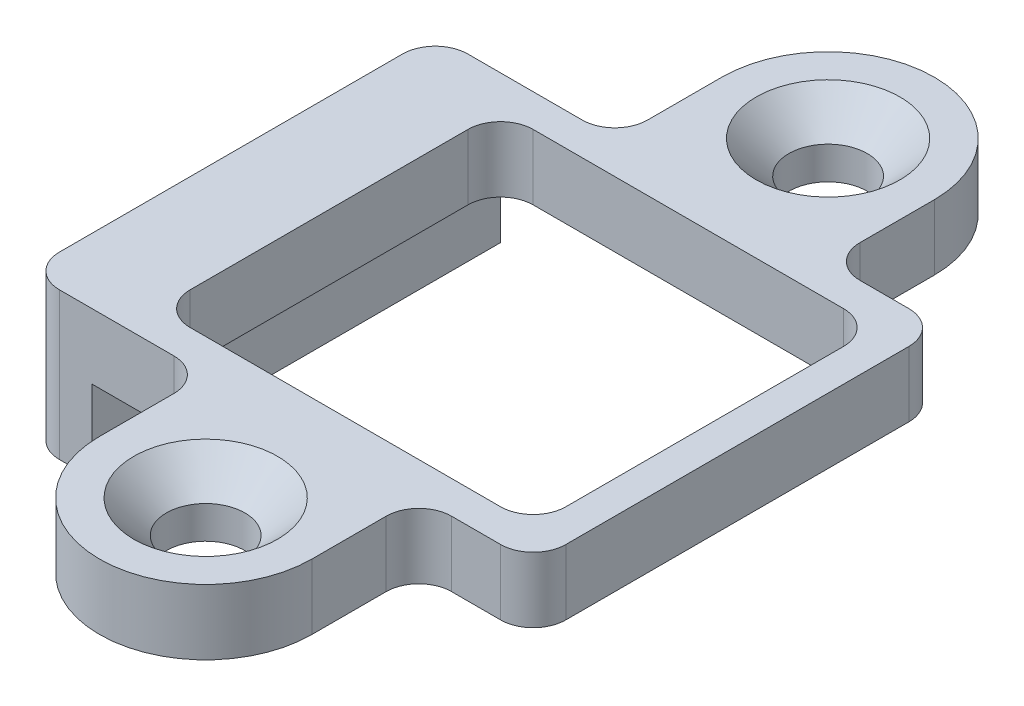
ISO-10303-21;
HEADER;
FILE_DESCRIPTION(('STEP AP214'),'2;1');
FILE_NAME('part.step','',(''),(''),'','','');
FILE_SCHEMA(('AUTOMOTIVE_DESIGN { 1 0 10303 214 1 1 1 1 }'));
ENDSEC;
DATA;
#1=APPLICATION_CONTEXT('core data for automotive mechanical design processes');
#2=APPLICATION_PROTOCOL_DEFINITION('international standard','automotive_design',2000,#1);
#3=PRODUCT_CONTEXT('',#1,'mechanical');
#4=PRODUCT('Part','Part','',(#3));
#5=PRODUCT_RELATED_PRODUCT_CATEGORY('part','',(#4));
#6=PRODUCT_DEFINITION_FORMATION('','',#4);
#7=PRODUCT_DEFINITION_CONTEXT('part definition',#1,'design');
#8=PRODUCT_DEFINITION('design','',#6,#7);
#9=PRODUCT_DEFINITION_SHAPE('','',#8);
#10=(LENGTH_UNIT() NAMED_UNIT(*) SI_UNIT(.MILLI.,.METRE.));
#11=(NAMED_UNIT(*) PLANE_ANGLE_UNIT() SI_UNIT($,.RADIAN.));
#12=(NAMED_UNIT(*) SI_UNIT($,.STERADIAN.) SOLID_ANGLE_UNIT());
#13=UNCERTAINTY_MEASURE_WITH_UNIT(LENGTH_MEASURE(1.E-05),#10,'distance_accuracy_value','');
#14=(GEOMETRIC_REPRESENTATION_CONTEXT(3) GLOBAL_UNCERTAINTY_ASSIGNED_CONTEXT((#13)) GLOBAL_UNIT_ASSIGNED_CONTEXT((#10,
#11,#12)) REPRESENTATION_CONTEXT('',''));
#15=CARTESIAN_POINT('',(0.,0.,0.));
#16=DIRECTION('',(0.,0.,1.));
#17=DIRECTION('',(1.,0.,0.));
#18=AXIS2_PLACEMENT_3D('',#15,#16,#17);
#19=CARTESIAN_POINT('',(0.,0.,0.));
#20=DIRECTION('',(0.,1.,0.));
#21=DIRECTION('',(0.,0.,1.));
#22=AXIS2_PLACEMENT_3D('',#19,#20,#21);
#23=PLANE('',#22);
#24=CARTESIAN_POINT('',(0.,0.,9.525));
#25=DIRECTION('',(0.,1.,0.));
#26=DIRECTION('',(0.,0.,1.));
#27=AXIS2_PLACEMENT_3D('',#24,#25,#26);
#28=CIRCLE('',#27,1.19999999999999);
#29=CARTESIAN_POINT('',(0.,0.,10.725));
#30=VERTEX_POINT('',#29);
#31=EDGE_CURVE('E374',#30,#30,#28,.T.);
#32=ORIENTED_EDGE('',*,*,#31,.T.);
#33=EDGE_LOOP('',(#32));
#34=FACE_BOUND('',#33,.T.);
#35=CARTESIAN_POINT('',(0.,0.,-9.525));
#36=DIRECTION('',(0.,1.,0.));
#37=DIRECTION('',(0.,0.,1.));
#38=AXIS2_PLACEMENT_3D('',#35,#36,#37);
#39=CIRCLE('',#38,1.19999999999999);
#40=CARTESIAN_POINT('',(0.,0.,-8.32500000000001));
#41=VERTEX_POINT('',#40);
#42=EDGE_CURVE('E275',#41,#41,#39,.T.);
#43=ORIENTED_EDGE('',*,*,#42,.T.);
#44=EDGE_LOOP('',(#43));
#45=FACE_BOUND('',#44,.T.);
#46=DIRECTION('',(0.,0.,1.));
#47=VECTOR('',#46,1.);
#48=CARTESIAN_POINT('',(5.75,0.,0.));
#49=LINE('',#48,#47);
#50=CARTESIAN_POINT('',(5.75,0.,-4.25000000000001));
#51=VERTEX_POINT('',#50);
#52=CARTESIAN_POINT('',(5.75,0.,4.25000000000001));
#53=VERTEX_POINT('',#52);
#54=EDGE_CURVE('E351',#51,#53,#49,.T.);
#55=ORIENTED_EDGE('',*,*,#54,.F.);
#56=CARTESIAN_POINT('',(4.75,0.,-4.25000000000001));
#57=DIRECTION('',(0.,1.,0.));
#58=DIRECTION('',(0.,0.,1.));
#59=AXIS2_PLACEMENT_3D('',#56,#57,#58);
#60=CIRCLE('',#59,1.);
#61=CARTESIAN_POINT('',(4.75,0.,-5.25000000000001));
#62=VERTEX_POINT('',#61);
#63=EDGE_CURVE('E467',#51,#62,#60,.T.);
#64=ORIENTED_EDGE('',*,*,#63,.T.);
#65=DIRECTION('',(-1.,0.,0.));
#66=VECTOR('',#65,1.);
#67=CARTESIAN_POINT('',(0.,0.,-5.25000000000001));
#68=LINE('',#67,#66);
#69=CARTESIAN_POINT('',(-4.75,0.,-5.25000000000001));
#70=VERTEX_POINT('',#69);
#71=EDGE_CURVE('E281',#62,#70,#68,.T.);
#72=ORIENTED_EDGE('',*,*,#71,.T.);
#73=CARTESIAN_POINT('',(-4.75,0.,-4.25000000000001));
#74=DIRECTION('',(0.,1.,0.));
#75=DIRECTION('',(0.,0.,1.));
#76=AXIS2_PLACEMENT_3D('',#73,#74,#75);
#77=CIRCLE('',#76,1.);
#78=CARTESIAN_POINT('',(-5.75,0.,-4.25000000000001));
#79=VERTEX_POINT('',#78);
#80=EDGE_CURVE('E471',#70,#79,#77,.T.);
#81=ORIENTED_EDGE('',*,*,#80,.T.);
#82=DIRECTION('',(0.,0.,1.));
#83=VECTOR('',#82,1.);
#84=CARTESIAN_POINT('',(-5.75,0.,0.));
#85=LINE('',#84,#83);
#86=CARTESIAN_POINT('',(-5.75,0.,4.25000000000001));
#87=VERTEX_POINT('',#86);
#88=EDGE_CURVE('E356',#79,#87,#85,.T.);
#89=ORIENTED_EDGE('',*,*,#88,.T.);
#90=CARTESIAN_POINT('',(-4.75,0.,4.25000000000001));
#91=DIRECTION('',(0.,1.,0.));
#92=DIRECTION('',(0.,0.,1.));
#93=AXIS2_PLACEMENT_3D('',#90,#91,#92);
#94=CIRCLE('',#93,1.);
#95=CARTESIAN_POINT('',(-4.75,0.,5.25000000000001));
#96=VERTEX_POINT('',#95);
#97=EDGE_CURVE('E53',#87,#96,#94,.T.);
#98=ORIENTED_EDGE('',*,*,#97,.T.);
#99=DIRECTION('',(-1.,0.,0.));
#100=VECTOR('',#99,1.);
#101=CARTESIAN_POINT('',(0.,0.,5.25000000000001));
#102=LINE('',#101,#100);
#103=CARTESIAN_POINT('',(4.75,0.,5.25000000000001));
#104=VERTEX_POINT('',#103);
#105=EDGE_CURVE('E354',#104,#96,#102,.T.);
#106=ORIENTED_EDGE('',*,*,#105,.F.);
#107=CARTESIAN_POINT('',(4.75,0.,4.25000000000001));
#108=DIRECTION('',(0.,1.,0.));
#109=DIRECTION('',(0.,0.,1.));
#110=AXIS2_PLACEMENT_3D('',#107,#108,#109);
#111=CIRCLE('',#110,1.);
#112=EDGE_CURVE('E67',#104,#53,#111,.T.);
#113=ORIENTED_EDGE('',*,*,#112,.T.);
#114=EDGE_LOOP('',(#55,#64,#72,#81,#89,#98,#106,#113));
#115=FACE_BOUND('',#114,.T.);
#116=DIRECTION('',(0.,0.,1.));
#117=VECTOR('',#116,1.);
#118=CARTESIAN_POINT('',(6.75,0.,0.));
#119=LINE('',#118,#117);
#120=CARTESIAN_POINT('',(6.75,0.,-5.25));
#121=VERTEX_POINT('',#120);
#122=CARTESIAN_POINT('',(6.75,0.,5.25));
#123=VERTEX_POINT('',#122);
#124=EDGE_CURVE('E335',#121,#123,#119,.T.);
#125=ORIENTED_EDGE('',*,*,#124,.T.);
#126=CARTESIAN_POINT('',(5.75,0.,5.25));
#127=DIRECTION('',(0.,1.,0.));
#128=DIRECTION('',(0.,0.,1.));
#129=AXIS2_PLACEMENT_3D('',#126,#127,#128);
#130=CIRCLE('',#129,1.);
#131=CARTESIAN_POINT('',(5.75,0.,6.25));
#132=VERTEX_POINT('',#131);
#133=EDGE_CURVE('E430',#123,#132,#130,.F.);
#134=ORIENTED_EDGE('',*,*,#133,.T.);
#135=DIRECTION('',(-1.,0.,0.));
#136=VECTOR('',#135,1.);
#137=CARTESIAN_POINT('',(0.,0.,6.25));
#138=LINE('',#137,#136);
#139=CARTESIAN_POINT('',(4.25,0.,6.25));
#140=VERTEX_POINT('',#139);
#141=EDGE_CURVE('E332',#132,#140,#138,.T.);
#142=ORIENTED_EDGE('',*,*,#141,.T.);
#143=CARTESIAN_POINT('',(4.25,0.,7.25));
#144=DIRECTION('',(0.,1.,0.));
#145=DIRECTION('',(0.,0.,1.));
#146=AXIS2_PLACEMENT_3D('',#143,#144,#145);
#147=CIRCLE('',#146,1.);
#148=CARTESIAN_POINT('',(3.25,0.,7.25));
#149=VERTEX_POINT('',#148);
#150=EDGE_CURVE('E459',#140,#149,#147,.T.);
#151=ORIENTED_EDGE('',*,*,#150,.T.);
#152=DIRECTION('',(0.,0.,1.));
#153=VECTOR('',#152,1.);
#154=CARTESIAN_POINT('',(3.25,0.,0.));
#155=LINE('',#154,#153);
#156=CARTESIAN_POINT('',(3.25,0.,9.525));
#157=VERTEX_POINT('',#156);
#158=EDGE_CURVE('E330',#149,#157,#155,.T.);
#159=ORIENTED_EDGE('',*,*,#158,.T.);
#160=CARTESIAN_POINT('',(0.,0.,9.525));
#161=DIRECTION('',(0.,1.,0.));
#162=DIRECTION('',(0.,0.,1.));
#163=AXIS2_PLACEMENT_3D('',#160,#161,#162);
#164=CIRCLE('',#163,3.25);
#165=CARTESIAN_POINT('',(-3.25,0.,9.525));
#166=VERTEX_POINT('',#165);
#167=EDGE_CURVE('E327',#166,#157,#164,.T.);
#168=ORIENTED_EDGE('',*,*,#167,.F.);
#169=DIRECTION('',(0.,0.,1.));
#170=VECTOR('',#169,1.);
#171=CARTESIAN_POINT('',(-3.25,0.,0.));
#172=LINE('',#171,#170);
#173=CARTESIAN_POINT('',(-3.25,0.,7.25));
#174=VERTEX_POINT('',#173);
#175=EDGE_CURVE('E325',#174,#166,#172,.T.);
#176=ORIENTED_EDGE('',*,*,#175,.F.);
#177=CARTESIAN_POINT('',(-4.25,0.,7.25));
#178=DIRECTION('',(0.,1.,0.));
#179=DIRECTION('',(0.,0.,1.));
#180=AXIS2_PLACEMENT_3D('',#177,#178,#179);
#181=CIRCLE('',#180,1.);
#182=CARTESIAN_POINT('',(-4.25,0.,6.25));
#183=VERTEX_POINT('',#182);
#184=EDGE_CURVE('E463',#174,#183,#181,.T.);
#185=ORIENTED_EDGE('',*,*,#184,.T.);
#186=DIRECTION('',(-1.,0.,0.));
#187=VECTOR('',#186,1.);
#188=CARTESIAN_POINT('',(0.,0.,6.25));
#189=LINE('',#188,#187);
#190=CARTESIAN_POINT('',(-6.75,0.,6.25));
#191=VERTEX_POINT('',#190);
#192=EDGE_CURVE('E276',#183,#191,#189,.T.);
#193=ORIENTED_EDGE('',*,*,#192,.T.);
#194=DIRECTION('',(0.,0.,1.));
#195=VECTOR('',#194,1.);
#196=CARTESIAN_POINT('',(-6.75,0.,0.));
#197=LINE('',#196,#195);
#198=CARTESIAN_POINT('',(-6.75,0.,-6.25));
#199=VERTEX_POINT('',#198);
#200=EDGE_CURVE('E258',#199,#191,#197,.T.);
#201=ORIENTED_EDGE('',*,*,#200,.F.);
#202=DIRECTION('',(-1.,0.,0.));
#203=VECTOR('',#202,1.);
#204=CARTESIAN_POINT('',(0.,0.,-6.25));
#205=LINE('',#204,#203);
#206=CARTESIAN_POINT('',(-4.25,0.,-6.25));
#207=VERTEX_POINT('',#206);
#208=EDGE_CURVE('E349',#207,#199,#205,.T.);
#209=ORIENTED_EDGE('',*,*,#208,.F.);
#210=CARTESIAN_POINT('',(-4.25,0.,-7.25));
#211=DIRECTION('',(0.,1.,0.));
#212=DIRECTION('',(0.,0.,1.));
#213=AXIS2_PLACEMENT_3D('',#210,#211,#212);
#214=CIRCLE('',#213,1.);
#215=CARTESIAN_POINT('',(-3.25,0.,-7.25));
#216=VERTEX_POINT('',#215);
#217=EDGE_CURVE('E451',#207,#216,#214,.T.);
#218=ORIENTED_EDGE('',*,*,#217,.T.);
#219=DIRECTION('',(0.,0.,1.));
#220=VECTOR('',#219,1.);
#221=CARTESIAN_POINT('',(-3.25,0.,0.));
#222=LINE('',#221,#220);
#223=CARTESIAN_POINT('',(-3.25,0.,-9.525));
#224=VERTEX_POINT('',#223);
#225=EDGE_CURVE('E346',#224,#216,#222,.T.);
#226=ORIENTED_EDGE('',*,*,#225,.F.);
#227=CARTESIAN_POINT('',(0.,0.,-9.525));
#228=DIRECTION('',(0.,1.,0.));
#229=DIRECTION('',(0.,0.,1.));
#230=AXIS2_PLACEMENT_3D('',#227,#228,#229);
#231=CIRCLE('',#230,3.25);
#232=CARTESIAN_POINT('',(3.24999999999999,0.,-9.525));
#233=VERTEX_POINT('',#232);
#234=EDGE_CURVE('E344',#233,#224,#231,.T.);
#235=ORIENTED_EDGE('',*,*,#234,.F.);
#236=DIRECTION('',(0.,0.,1.));
#237=VECTOR('',#236,1.);
#238=CARTESIAN_POINT('',(3.25,0.,0.));
#239=LINE('',#238,#237);
#240=CARTESIAN_POINT('',(3.25,0.,-7.25));
#241=VERTEX_POINT('',#240);
#242=EDGE_CURVE('E341',#233,#241,#239,.T.);
#243=ORIENTED_EDGE('',*,*,#242,.T.);
#244=CARTESIAN_POINT('',(4.24999999999999,0.,-7.25));
#245=DIRECTION('',(0.,1.,0.));
#246=DIRECTION('',(0.,0.,1.));
#247=AXIS2_PLACEMENT_3D('',#244,#245,#246);
#248=CIRCLE('',#247,1.);
#249=CARTESIAN_POINT('',(4.24999999999999,0.,-6.25));
#250=VERTEX_POINT('',#249);
#251=EDGE_CURVE('E455',#241,#250,#248,.T.);
#252=ORIENTED_EDGE('',*,*,#251,.T.);
#253=DIRECTION('',(-1.,0.,0.));
#254=VECTOR('',#253,1.);
#255=CARTESIAN_POINT('',(0.,0.,-6.25));
#256=LINE('',#255,#254);
#257=CARTESIAN_POINT('',(5.75,0.,-6.25));
#258=VERTEX_POINT('',#257);
#259=EDGE_CURVE('E338',#258,#250,#256,.T.);
#260=ORIENTED_EDGE('',*,*,#259,.F.);
#261=CARTESIAN_POINT('',(5.75,0.,-5.25));
#262=DIRECTION('',(0.,1.,0.));
#263=DIRECTION('',(0.,0.,1.));
#264=AXIS2_PLACEMENT_3D('',#261,#262,#263);
#265=CIRCLE('',#264,1.);
#266=EDGE_CURVE('E428',#258,#121,#265,.F.);
#267=ORIENTED_EDGE('',*,*,#266,.T.);
#268=EDGE_LOOP('',(#125,#134,#142,#151,#159,#168,#176,#185,#193,#201,#209,#218,#226,#235,#243,
#252,#260,#267));
#269=FACE_BOUND('',#268,.T.);
#270=ADVANCED_FACE('F45',(#34,#45,#115,#269),#23,.F.);
#271=CARTESIAN_POINT('',(5.75,2.,0.));
#272=DIRECTION('',(1.,0.,0.));
#273=DIRECTION('',(0.,0.,-1.));
#274=AXIS2_PLACEMENT_3D('',#271,#272,#273);
#275=PLANE('',#274);
#276=DIRECTION('',(0.,0.,1.));
#277=VECTOR('',#276,1.);
#278=CARTESIAN_POINT('',(5.75,2.,0.));
#279=LINE('',#278,#277);
#280=CARTESIAN_POINT('',(5.75,2.,-4.25000000000001));
#281=VERTEX_POINT('',#280);
#282=CARTESIAN_POINT('',(5.75,2.,4.25000000000001));
#283=VERTEX_POINT('',#282);
#284=EDGE_CURVE('E311',#281,#283,#279,.T.);
#285=ORIENTED_EDGE('',*,*,#284,.F.);
#286=DIRECTION('',(0.,-1.,0.));
#287=VECTOR('',#286,1.);
#288=CARTESIAN_POINT('',(5.75,2.,-4.25000000000001));
#289=LINE('',#288,#287);
#290=EDGE_CURVE('E434',#281,#51,#289,.T.);
#291=ORIENTED_EDGE('',*,*,#290,.T.);
#292=ORIENTED_EDGE('',*,*,#54,.T.);
#293=DIRECTION('',(0.,-1.,0.));
#294=VECTOR('',#293,1.);
#295=CARTESIAN_POINT('',(5.75,2.,4.25000000000001));
#296=LINE('',#295,#294);
#297=EDGE_CURVE('E432',#53,#283,#296,.F.);
#298=ORIENTED_EDGE('',*,*,#297,.T.);
#299=EDGE_LOOP('',(#285,#291,#292,#298));
#300=FACE_BOUND('',#299,.T.);
#301=ADVANCED_FACE('F499',(#300),#275,.F.);
#302=CARTESIAN_POINT('',(0.,2.,5.25000000000001));
#303=DIRECTION('',(0.,0.,1.));
#304=DIRECTION('',(1.,0.,0.));
#305=AXIS2_PLACEMENT_3D('',#302,#303,#304);
#306=PLANE('',#305);
#307=DIRECTION('',(-1.,0.,0.));
#308=VECTOR('',#307,1.);
#309=CARTESIAN_POINT('',(0.,2.,5.25000000000001));
#310=LINE('',#309,#308);
#311=CARTESIAN_POINT('',(4.75,2.,5.25000000000001));
#312=VERTEX_POINT('',#311);
#313=CARTESIAN_POINT('',(-4.75,2.,5.25000000000001));
#314=VERTEX_POINT('',#313);
#315=EDGE_CURVE('E314',#312,#314,#310,.T.);
#316=ORIENTED_EDGE('',*,*,#315,.F.);
#317=DIRECTION('',(0.,-1.,0.));
#318=VECTOR('',#317,1.);
#319=CARTESIAN_POINT('',(4.75,0.,5.25000000000001));
#320=LINE('',#319,#318);
#321=EDGE_CURVE('E449',#312,#104,#320,.T.);
#322=ORIENTED_EDGE('',*,*,#321,.T.);
#323=ORIENTED_EDGE('',*,*,#105,.T.);
#324=DIRECTION('',(0.,-1.,0.));
#325=VECTOR('',#324,1.);
#326=CARTESIAN_POINT('',(-4.75,2.,5.25000000000001));
#327=LINE('',#326,#325);
#328=EDGE_CURVE('E447',#96,#314,#327,.F.);
#329=ORIENTED_EDGE('',*,*,#328,.T.);
#330=EDGE_LOOP('',(#316,#322,#323,#329));
#331=FACE_BOUND('',#330,.T.);
#332=ADVANCED_FACE('F485',(#331),#306,.F.);
#333=CARTESIAN_POINT('',(-5.75,2.,0.));
#334=DIRECTION('',(1.,0.,0.));
#335=DIRECTION('',(0.,0.,-1.));
#336=AXIS2_PLACEMENT_3D('',#333,#334,#335);
#337=PLANE('',#336);
#338=ORIENTED_EDGE('',*,*,#88,.F.);
#339=DIRECTION('',(0.,-1.,0.));
#340=VECTOR('',#339,1.);
#341=CARTESIAN_POINT('',(-5.75,2.,-4.25000000000001));
#342=LINE('',#341,#340);
#343=CARTESIAN_POINT('',(-5.75,2.,-4.25000000000001));
#344=VERTEX_POINT('',#343);
#345=EDGE_CURVE('E445',#79,#344,#342,.F.);
#346=ORIENTED_EDGE('',*,*,#345,.T.);
#347=DIRECTION('',(0.,0.,1.));
#348=VECTOR('',#347,1.);
#349=CARTESIAN_POINT('',(-5.75,2.,0.));
#350=LINE('',#349,#348);
#351=CARTESIAN_POINT('',(-5.75,2.,4.25000000000001));
#352=VERTEX_POINT('',#351);
#353=EDGE_CURVE('E317',#344,#352,#350,.T.);
#354=ORIENTED_EDGE('',*,*,#353,.T.);
#355=DIRECTION('',(0.,-1.,0.));
#356=VECTOR('',#355,1.);
#357=CARTESIAN_POINT('',(-5.75,2.,4.25000000000001));
#358=LINE('',#357,#356);
#359=EDGE_CURVE('E442',#352,#87,#358,.T.);
#360=ORIENTED_EDGE('',*,*,#359,.T.);
#361=EDGE_LOOP('',(#338,#346,#354,#360));
#362=FACE_BOUND('',#361,.T.);
#363=ADVANCED_FACE('F516',(#362),#337,.T.);
#364=CARTESIAN_POINT('',(0.,2.,6.25));
#365=DIRECTION('',(0.,0.,1.));
#366=DIRECTION('',(1.,0.,0.));
#367=AXIS2_PLACEMENT_3D('',#364,#365,#366);
#368=PLANE('',#367);
#369=DIRECTION('',(-1.,0.,0.));
#370=VECTOR('',#369,1.);
#371=CARTESIAN_POINT('',(0.,2.,6.25));
#372=LINE('',#371,#370);
#373=CARTESIAN_POINT('',(-4.25,2.,6.25));
#374=VERTEX_POINT('',#373);
#375=CARTESIAN_POINT('',(-7.75,2.,6.25));
#376=VERTEX_POINT('',#375);
#377=EDGE_CURVE('E278',#374,#376,#372,.T.);
#378=ORIENTED_EDGE('',*,*,#377,.T.);
#379=DIRECTION('',(0.,-1.,0.));
#380=VECTOR('',#379,1.);
#381=CARTESIAN_POINT('',(-7.75,-2.5,6.25));
#382=LINE('',#381,#380);
#383=CARTESIAN_POINT('',(-7.75,-2.5,6.25));
#384=VERTEX_POINT('',#383);
#385=EDGE_CURVE('E267',#376,#384,#382,.T.);
#386=ORIENTED_EDGE('',*,*,#385,.T.);
#387=DIRECTION('',(-1.,0.,0.));
#388=VECTOR('',#387,1.);
#389=CARTESIAN_POINT('',(0.,-2.5,6.25));
#390=LINE('',#389,#388);
#391=CARTESIAN_POINT('',(-6.75,-2.5,6.25));
#392=VERTEX_POINT('',#391);
#393=EDGE_CURVE('E247',#392,#384,#390,.T.);
#394=ORIENTED_EDGE('',*,*,#393,.F.);
#395=DIRECTION('',(0.,1.,0.));
#396=VECTOR('',#395,1.);
#397=CARTESIAN_POINT('',(-6.75,-2.5,6.25));
#398=LINE('',#397,#396);
#399=EDGE_CURVE('E252',#392,#191,#398,.T.);
#400=ORIENTED_EDGE('',*,*,#399,.T.);
#401=ORIENTED_EDGE('',*,*,#192,.F.);
#402=DIRECTION('',(0.,-1.,0.));
#403=VECTOR('',#402,1.);
#404=CARTESIAN_POINT('',(-4.25,2.,6.25));
#405=LINE('',#404,#403);
#406=EDGE_CURVE('E370',#183,#374,#405,.F.);
#407=ORIENTED_EDGE('',*,*,#406,.T.);
#408=EDGE_LOOP('',(#378,#386,#394,#400,#401,#407));
#409=FACE_BOUND('',#408,.T.);
#410=ADVANCED_FACE('F265',(#409),#368,.T.);
#411=CARTESIAN_POINT('',(-3.25,2.,0.));
#412=DIRECTION('',(1.,0.,0.));
#413=DIRECTION('',(0.,0.,-1.));
#414=AXIS2_PLACEMENT_3D('',#411,#412,#413);
#415=PLANE('',#414);
#416=DIRECTION('',(0.,0.,1.));
#417=VECTOR('',#416,1.);
#418=CARTESIAN_POINT('',(-3.25,2.,0.));
#419=LINE('',#418,#417);
#420=CARTESIAN_POINT('',(-3.25,2.,7.25));
#421=VERTEX_POINT('',#420);
#422=CARTESIAN_POINT('',(-3.25,2.,9.525));
#423=VERTEX_POINT('',#422);
#424=EDGE_CURVE('E280',#421,#423,#419,.T.);
#425=ORIENTED_EDGE('',*,*,#424,.F.);
#426=DIRECTION('',(0.,-1.,0.));
#427=VECTOR('',#426,1.);
#428=CARTESIAN_POINT('',(-3.25,2.,7.25));
#429=LINE('',#428,#427);
#430=EDGE_CURVE('E420',#421,#174,#429,.T.);
#431=ORIENTED_EDGE('',*,*,#430,.T.);
#432=ORIENTED_EDGE('',*,*,#175,.T.);
#433=DIRECTION('',(0.,-1.,0.));
#434=VECTOR('',#433,1.);
#435=CARTESIAN_POINT('',(-3.25,2.,9.525));
#436=LINE('',#435,#434);
#437=EDGE_CURVE('E367',#423,#166,#436,.T.);
#438=ORIENTED_EDGE('',*,*,#437,.F.);
#439=EDGE_LOOP('',(#425,#431,#432,#438));
#440=FACE_BOUND('',#439,.T.);
#441=ADVANCED_FACE('F560',(#440),#415,.F.);
#442=CARTESIAN_POINT('',(0.,2.,9.525));
#443=DIRECTION('',(0.,-1.,0.));
#444=DIRECTION('',(0.,0.,-1.));
#445=AXIS2_PLACEMENT_3D('',#442,#443,#444);
#446=CYLINDRICAL_SURFACE('',#445,3.25);
#447=ORIENTED_EDGE('',*,*,#167,.T.);
#448=DIRECTION('',(0.,-1.,0.));
#449=VECTOR('',#448,1.);
#450=CARTESIAN_POINT('',(3.25,2.,9.525));
#451=LINE('',#450,#449);
#452=CARTESIAN_POINT('',(3.25,2.,9.525));
#453=VERTEX_POINT('',#452);
#454=EDGE_CURVE('E364',#453,#157,#451,.T.);
#455=ORIENTED_EDGE('',*,*,#454,.F.);
#456=CARTESIAN_POINT('',(0.,2.,9.525));
#457=DIRECTION('',(0.,1.,0.));
#458=DIRECTION('',(0.,0.,1.));
#459=AXIS2_PLACEMENT_3D('',#456,#457,#458);
#460=CIRCLE('',#459,3.25);
#461=EDGE_CURVE('E283',#423,#453,#460,.T.);
#462=ORIENTED_EDGE('',*,*,#461,.F.);
#463=ORIENTED_EDGE('',*,*,#437,.T.);
#464=EDGE_LOOP('',(#447,#455,#462,#463));
#465=FACE_BOUND('',#464,.T.);
#466=ADVANCED_FACE('F556',(#465),#446,.T.);
#467=CARTESIAN_POINT('',(3.25,2.,0.));
#468=DIRECTION('',(1.,0.,0.));
#469=DIRECTION('',(0.,0.,-1.));
#470=AXIS2_PLACEMENT_3D('',#467,#468,#469);
#471=PLANE('',#470);
#472=ORIENTED_EDGE('',*,*,#158,.F.);
#473=DIRECTION('',(0.,-1.,0.));
#474=VECTOR('',#473,1.);
#475=CARTESIAN_POINT('',(3.25,2.,7.25));
#476=LINE('',#475,#474);
#477=CARTESIAN_POINT('',(3.25,2.,7.25));
#478=VERTEX_POINT('',#477);
#479=EDGE_CURVE('E418',#149,#478,#476,.F.);
#480=ORIENTED_EDGE('',*,*,#479,.T.);
#481=DIRECTION('',(0.,0.,1.));
#482=VECTOR('',#481,1.);
#483=CARTESIAN_POINT('',(3.25,2.,0.));
#484=LINE('',#483,#482);
#485=EDGE_CURVE('E286',#478,#453,#484,.T.);
#486=ORIENTED_EDGE('',*,*,#485,.T.);
#487=ORIENTED_EDGE('',*,*,#454,.T.);
#488=EDGE_LOOP('',(#472,#480,#486,#487));
#489=FACE_BOUND('',#488,.T.);
#490=ADVANCED_FACE('F552',(#489),#471,.T.);
#491=CARTESIAN_POINT('',(0.,2.,6.25));
#492=DIRECTION('',(0.,0.,1.));
#493=DIRECTION('',(1.,0.,0.));
#494=AXIS2_PLACEMENT_3D('',#491,#492,#493);
#495=PLANE('',#494);
#496=DIRECTION('',(-1.,0.,0.));
#497=VECTOR('',#496,1.);
#498=CARTESIAN_POINT('',(0.,2.,6.25));
#499=LINE('',#498,#497);
#500=CARTESIAN_POINT('',(5.75,2.,6.25));
#501=VERTEX_POINT('',#500);
#502=CARTESIAN_POINT('',(4.25,2.,6.25));
#503=VERTEX_POINT('',#502);
#504=EDGE_CURVE('E288',#501,#503,#499,.T.);
#505=ORIENTED_EDGE('',*,*,#504,.T.);
#506=DIRECTION('',(0.,-1.,0.));
#507=VECTOR('',#506,1.);
#508=CARTESIAN_POINT('',(4.25,0.,6.25));
#509=LINE('',#508,#507);
#510=EDGE_CURVE('E415',#503,#140,#509,.T.);
#511=ORIENTED_EDGE('',*,*,#510,.T.);
#512=ORIENTED_EDGE('',*,*,#141,.F.);
#513=DIRECTION('',(0.,-1.,0.));
#514=VECTOR('',#513,1.);
#515=CARTESIAN_POINT('',(5.75,2.,6.25));
#516=LINE('',#515,#514);
#517=EDGE_CURVE('E413',#132,#501,#516,.F.);
#518=ORIENTED_EDGE('',*,*,#517,.T.);
#519=EDGE_LOOP('',(#505,#511,#512,#518));
#520=FACE_BOUND('',#519,.T.);
#521=ADVANCED_FACE('F548',(#520),#495,.T.);
#522=CARTESIAN_POINT('',(6.75,2.,0.));
#523=DIRECTION('',(1.,0.,0.));
#524=DIRECTION('',(0.,0.,-1.));
#525=AXIS2_PLACEMENT_3D('',#522,#523,#524);
#526=PLANE('',#525);
#527=DIRECTION('',(0.,0.,1.));
#528=VECTOR('',#527,1.);
#529=CARTESIAN_POINT('',(6.75,2.,0.));
#530=LINE('',#529,#528);
#531=CARTESIAN_POINT('',(6.75,2.,-5.25));
#532=VERTEX_POINT('',#531);
#533=CARTESIAN_POINT('',(6.75,2.,5.25));
#534=VERTEX_POINT('',#533);
#535=EDGE_CURVE('E291',#532,#534,#530,.T.);
#536=ORIENTED_EDGE('',*,*,#535,.T.);
#537=DIRECTION('',(0.,-1.,0.));
#538=VECTOR('',#537,1.);
#539=CARTESIAN_POINT('',(6.75,2.,5.25));
#540=LINE('',#539,#538);
#541=EDGE_CURVE('E425',#534,#123,#540,.T.);
#542=ORIENTED_EDGE('',*,*,#541,.T.);
#543=ORIENTED_EDGE('',*,*,#124,.F.);
#544=DIRECTION('',(0.,-1.,0.));
#545=VECTOR('',#544,1.);
#546=CARTESIAN_POINT('',(6.75,2.,-5.25));
#547=LINE('',#546,#545);
#548=EDGE_CURVE('E423',#121,#532,#547,.F.);
#549=ORIENTED_EDGE('',*,*,#548,.T.);
#550=EDGE_LOOP('',(#536,#542,#543,#549));
#551=FACE_BOUND('',#550,.T.);
#552=ADVANCED_FACE('F544',(#551),#526,.T.);
#553=CARTESIAN_POINT('',(0.,2.,-6.25));
#554=DIRECTION('',(0.,0.,1.));
#555=DIRECTION('',(1.,0.,0.));
#556=AXIS2_PLACEMENT_3D('',#553,#554,#555);
#557=PLANE('',#556);
#558=ORIENTED_EDGE('',*,*,#259,.T.);
#559=DIRECTION('',(0.,-1.,0.));
#560=VECTOR('',#559,1.);
#561=CARTESIAN_POINT('',(4.24999999999999,2.,-6.25));
#562=LINE('',#561,#560);
#563=CARTESIAN_POINT('',(4.24999999999999,2.,-6.25));
#564=VERTEX_POINT('',#563);
#565=EDGE_CURVE('E411',#250,#564,#562,.F.);
#566=ORIENTED_EDGE('',*,*,#565,.T.);
#567=DIRECTION('',(-1.,0.,0.));
#568=VECTOR('',#567,1.);
#569=CARTESIAN_POINT('',(0.,2.,-6.25));
#570=LINE('',#569,#568);
#571=CARTESIAN_POINT('',(5.75,2.,-6.25));
#572=VERTEX_POINT('',#571);
#573=EDGE_CURVE('E294',#572,#564,#570,.T.);
#574=ORIENTED_EDGE('',*,*,#573,.F.);
#575=DIRECTION('',(0.,-1.,0.));
#576=VECTOR('',#575,1.);
#577=CARTESIAN_POINT('',(5.75,0.,-6.25));
#578=LINE('',#577,#576);
#579=EDGE_CURVE('E408',#572,#258,#578,.T.);
#580=ORIENTED_EDGE('',*,*,#579,.T.);
#581=EDGE_LOOP('',(#558,#566,#574,#580));
#582=FACE_BOUND('',#581,.T.);
#583=ADVANCED_FACE('F540',(#582),#557,.F.);
#584=CARTESIAN_POINT('',(3.25,2.,0.));
#585=DIRECTION('',(1.,0.,0.));
#586=DIRECTION('',(0.,0.,-1.));
#587=AXIS2_PLACEMENT_3D('',#584,#585,#586);
#588=PLANE('',#587);
#589=DIRECTION('',(0.,0.,1.));
#590=VECTOR('',#589,1.);
#591=CARTESIAN_POINT('',(3.25,2.,0.));
#592=LINE('',#591,#590);
#593=CARTESIAN_POINT('',(3.24999999999999,2.,-9.525));
#594=VERTEX_POINT('',#593);
#595=CARTESIAN_POINT('',(3.25,2.,-7.25));
#596=VERTEX_POINT('',#595);
#597=EDGE_CURVE('E297',#594,#596,#592,.T.);
#598=ORIENTED_EDGE('',*,*,#597,.T.);
#599=DIRECTION('',(0.,-1.,0.));
#600=VECTOR('',#599,1.);
#601=CARTESIAN_POINT('',(3.25,2.,-7.25));
#602=LINE('',#601,#600);
#603=EDGE_CURVE('E405',#596,#241,#602,.T.);
#604=ORIENTED_EDGE('',*,*,#603,.T.);
#605=ORIENTED_EDGE('',*,*,#242,.F.);
#606=DIRECTION('',(0.,-1.,0.));
#607=VECTOR('',#606,1.);
#608=CARTESIAN_POINT('',(3.24999999999999,2.,-9.525));
#609=LINE('',#608,#607);
#610=EDGE_CURVE('E362',#594,#233,#609,.T.);
#611=ORIENTED_EDGE('',*,*,#610,.F.);
#612=EDGE_LOOP('',(#598,#604,#605,#611));
#613=FACE_BOUND('',#612,.T.);
#614=ADVANCED_FACE('F536',(#613),#588,.T.);
#615=CARTESIAN_POINT('',(0.,2.,-9.525));
#616=DIRECTION('',(0.,-1.,0.));
#617=DIRECTION('',(0.,0.,-1.));
#618=AXIS2_PLACEMENT_3D('',#615,#616,#617);
#619=CYLINDRICAL_SURFACE('',#618,3.25);
#620=ORIENTED_EDGE('',*,*,#234,.T.);
#621=DIRECTION('',(0.,-1.,0.));
#622=VECTOR('',#621,1.);
#623=CARTESIAN_POINT('',(-3.25,2.,-9.525));
#624=LINE('',#623,#622);
#625=CARTESIAN_POINT('',(-3.25,2.,-9.525));
#626=VERTEX_POINT('',#625);
#627=EDGE_CURVE('E323',#626,#224,#624,.T.);
#628=ORIENTED_EDGE('',*,*,#627,.F.);
#629=CARTESIAN_POINT('',(0.,2.,-9.525));
#630=DIRECTION('',(0.,1.,0.));
#631=DIRECTION('',(0.,0.,1.));
#632=AXIS2_PLACEMENT_3D('',#629,#630,#631);
#633=CIRCLE('',#632,3.25);
#634=EDGE_CURVE('E300',#594,#626,#633,.T.);
#635=ORIENTED_EDGE('',*,*,#634,.F.);
#636=ORIENTED_EDGE('',*,*,#610,.T.);
#637=EDGE_LOOP('',(#620,#628,#635,#636));
#638=FACE_BOUND('',#637,.T.);
#639=ADVANCED_FACE('F532',(#638),#619,.T.);
#640=CARTESIAN_POINT('',(-3.25,2.,0.));
#641=DIRECTION('',(1.,0.,0.));
#642=DIRECTION('',(0.,0.,-1.));
#643=AXIS2_PLACEMENT_3D('',#640,#641,#642);
#644=PLANE('',#643);
#645=ORIENTED_EDGE('',*,*,#225,.T.);
#646=DIRECTION('',(0.,-1.,0.));
#647=VECTOR('',#646,1.);
#648=CARTESIAN_POINT('',(-3.25,2.,-7.25));
#649=LINE('',#648,#647);
#650=CARTESIAN_POINT('',(-3.25,2.,-7.25));
#651=VERTEX_POINT('',#650);
#652=EDGE_CURVE('E403',#216,#651,#649,.F.);
#653=ORIENTED_EDGE('',*,*,#652,.T.);
#654=DIRECTION('',(0.,0.,1.));
#655=VECTOR('',#654,1.);
#656=CARTESIAN_POINT('',(-3.25,2.,0.));
#657=LINE('',#656,#655);
#658=EDGE_CURVE('E302',#626,#651,#657,.T.);
#659=ORIENTED_EDGE('',*,*,#658,.F.);
#660=ORIENTED_EDGE('',*,*,#627,.T.);
#661=EDGE_LOOP('',(#645,#653,#659,#660));
#662=FACE_BOUND('',#661,.T.);
#663=ADVANCED_FACE('F528',(#662),#644,.F.);
#664=CARTESIAN_POINT('',(0.,2.,-6.25));
#665=DIRECTION('',(0.,0.,1.));
#666=DIRECTION('',(1.,0.,0.));
#667=AXIS2_PLACEMENT_3D('',#664,#665,#666);
#668=PLANE('',#667);
#669=DIRECTION('',(-1.,0.,0.));
#670=VECTOR('',#669,1.);
#671=CARTESIAN_POINT('',(0.,-2.5,-6.25));
#672=LINE('',#671,#670);
#673=CARTESIAN_POINT('',(-6.75,-2.5,-6.25));
#674=VERTEX_POINT('',#673);
#675=CARTESIAN_POINT('',(-7.75,-2.5,-6.25));
#676=VERTEX_POINT('',#675);
#677=EDGE_CURVE('E249',#674,#676,#672,.T.);
#678=ORIENTED_EDGE('',*,*,#677,.T.);
#679=DIRECTION('',(0.,-1.,0.));
#680=VECTOR('',#679,1.);
#681=CARTESIAN_POINT('',(-7.75,2.,-6.25));
#682=LINE('',#681,#680);
#683=CARTESIAN_POINT('',(-7.75,2.,-6.25));
#684=VERTEX_POINT('',#683);
#685=EDGE_CURVE('E401',#676,#684,#682,.F.);
#686=ORIENTED_EDGE('',*,*,#685,.T.);
#687=DIRECTION('',(-1.,0.,0.));
#688=VECTOR('',#687,1.);
#689=CARTESIAN_POINT('',(0.,2.,-6.25));
#690=LINE('',#689,#688);
#691=CARTESIAN_POINT('',(-4.25,2.,-6.25));
#692=VERTEX_POINT('',#691);
#693=EDGE_CURVE('E305',#692,#684,#690,.T.);
#694=ORIENTED_EDGE('',*,*,#693,.F.);
#695=DIRECTION('',(0.,-1.,0.));
#696=VECTOR('',#695,1.);
#697=CARTESIAN_POINT('',(-4.25,0.,-6.25));
#698=LINE('',#697,#696);
#699=EDGE_CURVE('E398',#692,#207,#698,.T.);
#700=ORIENTED_EDGE('',*,*,#699,.T.);
#701=ORIENTED_EDGE('',*,*,#208,.T.);
#702=DIRECTION('',(0.,1.,0.));
#703=VECTOR('',#702,1.);
#704=CARTESIAN_POINT('',(-6.75,-2.5,-6.25));
#705=LINE('',#704,#703);
#706=EDGE_CURVE('E261',#674,#199,#705,.T.);
#707=ORIENTED_EDGE('',*,*,#706,.F.);
#708=EDGE_LOOP('',(#678,#686,#694,#700,#701,#707));
#709=FACE_BOUND('',#708,.T.);
#710=ADVANCED_FACE('F524',(#709),#668,.F.);
#711=CARTESIAN_POINT('',(-8.75,2.,0.));
#712=DIRECTION('',(1.,0.,0.));
#713=DIRECTION('',(0.,0.,-1.));
#714=AXIS2_PLACEMENT_3D('',#711,#712,#713);
#715=PLANE('',#714);
#716=DIRECTION('',(0.,0.,1.));
#717=VECTOR('',#716,1.);
#718=CARTESIAN_POINT('',(-8.75,-2.5,0.));
#719=LINE('',#718,#717);
#720=CARTESIAN_POINT('',(-8.75,-2.5,-5.25));
#721=VERTEX_POINT('',#720);
#722=CARTESIAN_POINT('',(-8.75,-2.5,5.25));
#723=VERTEX_POINT('',#722);
#724=EDGE_CURVE('E268',#721,#723,#719,.T.);
#725=ORIENTED_EDGE('',*,*,#724,.T.);
#726=DIRECTION('',(0.,-1.,0.));
#727=VECTOR('',#726,1.);
#728=CARTESIAN_POINT('',(-8.75,2.,5.25));
#729=LINE('',#728,#727);
#730=CARTESIAN_POINT('',(-8.75,2.,5.25));
#731=VERTEX_POINT('',#730);
#732=EDGE_CURVE('E388',#723,#731,#729,.F.);
#733=ORIENTED_EDGE('',*,*,#732,.T.);
#734=DIRECTION('',(0.,0.,1.));
#735=VECTOR('',#734,1.);
#736=CARTESIAN_POINT('',(-8.75,2.,0.));
#737=LINE('',#736,#735);
#738=CARTESIAN_POINT('',(-8.75,2.,-5.25));
#739=VERTEX_POINT('',#738);
#740=EDGE_CURVE('E308',#739,#731,#737,.T.);
#741=ORIENTED_EDGE('',*,*,#740,.F.);
#742=DIRECTION('',(0.,-1.,0.));
#743=VECTOR('',#742,1.);
#744=CARTESIAN_POINT('',(-8.75,2.,-5.25));
#745=LINE('',#744,#743);
#746=EDGE_CURVE('E385',#739,#721,#745,.T.);
#747=ORIENTED_EDGE('',*,*,#746,.T.);
#748=EDGE_LOOP('',(#725,#733,#741,#747));
#749=FACE_BOUND('',#748,.T.);
#750=ADVANCED_FACE('F514',(#749),#715,.F.);
#751=CARTESIAN_POINT('',(0.,2.,-5.25000000000001));
#752=DIRECTION('',(0.,0.,1.));
#753=DIRECTION('',(1.,0.,0.));
#754=AXIS2_PLACEMENT_3D('',#751,#752,#753);
#755=PLANE('',#754);
#756=ORIENTED_EDGE('',*,*,#71,.F.);
#757=DIRECTION('',(0.,-1.,0.));
#758=VECTOR('',#757,1.);
#759=CARTESIAN_POINT('',(4.75,2.,-5.25000000000001));
#760=LINE('',#759,#758);
#761=CARTESIAN_POINT('',(4.75,2.,-5.25000000000001));
#762=VERTEX_POINT('',#761);
#763=EDGE_CURVE('E440',#62,#762,#760,.F.);
#764=ORIENTED_EDGE('',*,*,#763,.T.);
#765=DIRECTION('',(-1.,0.,0.));
#766=VECTOR('',#765,1.);
#767=CARTESIAN_POINT('',(0.,2.,-5.25000000000001));
#768=LINE('',#767,#766);
#769=CARTESIAN_POINT('',(-4.75,2.,-5.25000000000001));
#770=VERTEX_POINT('',#769);
#771=EDGE_CURVE('E320',#762,#770,#768,.T.);
#772=ORIENTED_EDGE('',*,*,#771,.T.);
#773=DIRECTION('',(0.,-1.,0.));
#774=VECTOR('',#773,1.);
#775=CARTESIAN_POINT('',(-4.75,0.,-5.25000000000001));
#776=LINE('',#775,#774);
#777=EDGE_CURVE('E437',#770,#70,#776,.T.);
#778=ORIENTED_EDGE('',*,*,#777,.T.);
#779=EDGE_LOOP('',(#756,#764,#772,#778));
#780=FACE_BOUND('',#779,.T.);
#781=ADVANCED_FACE('F511',(#780),#755,.T.);
#782=CARTESIAN_POINT('',(0.,2.,0.));
#783=DIRECTION('',(0.,1.,0.));
#784=DIRECTION('',(0.,0.,1.));
#785=AXIS2_PLACEMENT_3D('',#782,#783,#784);
#786=PLANE('',#785);
#787=CARTESIAN_POINT('',(0.,2.,9.525));
#788=DIRECTION('',(0.,1.,0.));
#789=DIRECTION('',(0.,0.,1.));
#790=AXIS2_PLACEMENT_3D('',#787,#788,#789);
#791=CIRCLE('',#790,2.2);
#792=CARTESIAN_POINT('',(0.,2.,11.725));
#793=VERTEX_POINT('',#792);
#794=EDGE_CURVE('E673',#793,#793,#791,.T.);
#795=ORIENTED_EDGE('',*,*,#794,.F.);
#796=EDGE_LOOP('',(#795));
#797=FACE_BOUND('',#796,.T.);
#798=CARTESIAN_POINT('',(0.,2.,-9.525));
#799=DIRECTION('',(0.,1.,0.));
#800=DIRECTION('',(0.,0.,1.));
#801=AXIS2_PLACEMENT_3D('',#798,#799,#800);
#802=CIRCLE('',#801,2.2);
#803=CARTESIAN_POINT('',(0.,2.,-7.325));
#804=VERTEX_POINT('',#803);
#805=EDGE_CURVE('E377',#804,#804,#802,.T.);
#806=ORIENTED_EDGE('',*,*,#805,.F.);
#807=EDGE_LOOP('',(#806));
#808=FACE_BOUND('',#807,.T.);
#809=ORIENTED_EDGE('',*,*,#740,.T.);
#810=CARTESIAN_POINT('',(-7.75,2.,5.25));
#811=DIRECTION('',(0.,1.,0.));
#812=DIRECTION('',(0.,0.,1.));
#813=AXIS2_PLACEMENT_3D('',#810,#811,#812);
#814=CIRCLE('',#813,1.);
#815=EDGE_CURVE('E396',#731,#376,#814,.T.);
#816=ORIENTED_EDGE('',*,*,#815,.T.);
#817=ORIENTED_EDGE('',*,*,#377,.F.);
#818=CARTESIAN_POINT('',(-4.25,2.,7.25));
#819=DIRECTION('',(0.,1.,0.));
#820=DIRECTION('',(0.,0.,1.));
#821=AXIS2_PLACEMENT_3D('',#818,#819,#820);
#822=CIRCLE('',#821,1.);
#823=EDGE_CURVE('E465',#374,#421,#822,.F.);
#824=ORIENTED_EDGE('',*,*,#823,.T.);
#825=ORIENTED_EDGE('',*,*,#424,.T.);
#826=ORIENTED_EDGE('',*,*,#461,.T.);
#827=ORIENTED_EDGE('',*,*,#485,.F.);
#828=CARTESIAN_POINT('',(4.25,2.,7.25));
#829=DIRECTION('',(0.,1.,0.));
#830=DIRECTION('',(0.,0.,1.));
#831=AXIS2_PLACEMENT_3D('',#828,#829,#830);
#832=CIRCLE('',#831,1.);
#833=EDGE_CURVE('E461',#478,#503,#832,.F.);
#834=ORIENTED_EDGE('',*,*,#833,.T.);
#835=ORIENTED_EDGE('',*,*,#504,.F.);
#836=CARTESIAN_POINT('',(5.75,2.,5.25));
#837=DIRECTION('',(0.,1.,0.));
#838=DIRECTION('',(0.,0.,1.));
#839=AXIS2_PLACEMENT_3D('',#836,#837,#838);
#840=CIRCLE('',#839,1.);
#841=EDGE_CURVE('E392',#501,#534,#840,.T.);
#842=ORIENTED_EDGE('',*,*,#841,.T.);
#843=ORIENTED_EDGE('',*,*,#535,.F.);
#844=CARTESIAN_POINT('',(5.75,2.,-5.25));
#845=DIRECTION('',(0.,1.,0.));
#846=DIRECTION('',(0.,0.,1.));
#847=AXIS2_PLACEMENT_3D('',#844,#845,#846);
#848=CIRCLE('',#847,1.);
#849=EDGE_CURVE('E390',#532,#572,#848,.T.);
#850=ORIENTED_EDGE('',*,*,#849,.T.);
#851=ORIENTED_EDGE('',*,*,#573,.T.);
#852=CARTESIAN_POINT('',(4.24999999999999,2.,-7.25));
#853=DIRECTION('',(0.,1.,0.));
#854=DIRECTION('',(0.,0.,1.));
#855=AXIS2_PLACEMENT_3D('',#852,#853,#854);
#856=CIRCLE('',#855,1.);
#857=EDGE_CURVE('E457',#564,#596,#856,.F.);
#858=ORIENTED_EDGE('',*,*,#857,.T.);
#859=ORIENTED_EDGE('',*,*,#597,.F.);
#860=ORIENTED_EDGE('',*,*,#634,.T.);
#861=ORIENTED_EDGE('',*,*,#658,.T.);
#862=CARTESIAN_POINT('',(-4.25,2.,-7.25));
#863=DIRECTION('',(0.,1.,0.));
#864=DIRECTION('',(0.,0.,1.));
#865=AXIS2_PLACEMENT_3D('',#862,#863,#864);
#866=CIRCLE('',#865,1.);
#867=EDGE_CURVE('E453',#651,#692,#866,.F.);
#868=ORIENTED_EDGE('',*,*,#867,.T.);
#869=ORIENTED_EDGE('',*,*,#693,.T.);
#870=CARTESIAN_POINT('',(-7.75,2.,-5.25));
#871=DIRECTION('',(0.,1.,0.));
#872=DIRECTION('',(0.,0.,1.));
#873=AXIS2_PLACEMENT_3D('',#870,#871,#872);
#874=CIRCLE('',#873,1.);
#875=EDGE_CURVE('E394',#684,#739,#874,.T.);
#876=ORIENTED_EDGE('',*,*,#875,.T.);
#877=EDGE_LOOP('',(#809,#816,#817,#824,#825,#826,#827,#834,#835,#842,#843,#850,#851,#858,#859,
#860,#861,#868,#869,#876));
#878=FACE_BOUND('',#877,.T.);
#879=ORIENTED_EDGE('',*,*,#771,.F.);
#880=CARTESIAN_POINT('',(4.75,2.,-4.25000000000001));
#881=DIRECTION('',(0.,1.,0.));
#882=DIRECTION('',(0.,0.,1.));
#883=AXIS2_PLACEMENT_3D('',#880,#881,#882);
#884=CIRCLE('',#883,1.);
#885=EDGE_CURVE('E469',#762,#281,#884,.F.);
#886=ORIENTED_EDGE('',*,*,#885,.T.);
#887=ORIENTED_EDGE('',*,*,#284,.T.);
#888=CARTESIAN_POINT('',(4.75,2.,4.25000000000001));
#889=DIRECTION('',(0.,1.,0.));
#890=DIRECTION('',(0.,0.,1.));
#891=AXIS2_PLACEMENT_3D('',#888,#889,#890);
#892=CIRCLE('',#891,1.);
#893=EDGE_CURVE('E476',#283,#312,#892,.F.);
#894=ORIENTED_EDGE('',*,*,#893,.T.);
#895=ORIENTED_EDGE('',*,*,#315,.T.);
#896=CARTESIAN_POINT('',(-4.75,2.,4.25000000000001));
#897=DIRECTION('',(0.,1.,0.));
#898=DIRECTION('',(0.,0.,1.));
#899=AXIS2_PLACEMENT_3D('',#896,#897,#898);
#900=CIRCLE('',#899,1.);
#901=EDGE_CURVE('E13',#314,#352,#900,.F.);
#902=ORIENTED_EDGE('',*,*,#901,.T.);
#903=ORIENTED_EDGE('',*,*,#353,.F.);
#904=CARTESIAN_POINT('',(-4.75,2.,-4.25000000000001));
#905=DIRECTION('',(0.,1.,0.));
#906=DIRECTION('',(0.,0.,1.));
#907=AXIS2_PLACEMENT_3D('',#904,#905,#906);
#908=CIRCLE('',#907,1.);
#909=EDGE_CURVE('E473',#344,#770,#908,.F.);
#910=ORIENTED_EDGE('',*,*,#909,.T.);
#911=EDGE_LOOP('',(#879,#886,#887,#894,#895,#902,#903,#910));
#912=FACE_BOUND('',#911,.T.);
#913=ADVANCED_FACE('F481',(#797,#808,#878,#912),#786,.T.);
#914=CARTESIAN_POINT('',(-6.75,-2.5,0.));
#915=DIRECTION('',(-1.,0.,0.));
#916=DIRECTION('',(0.,0.,1.));
#917=AXIS2_PLACEMENT_3D('',#914,#915,#916);
#918=PLANE('',#917);
#919=ORIENTED_EDGE('',*,*,#200,.T.);
#920=ORIENTED_EDGE('',*,*,#399,.F.);
#921=DIRECTION('',(0.,0.,1.));
#922=VECTOR('',#921,1.);
#923=CARTESIAN_POINT('',(-6.75,-2.5,0.));
#924=LINE('',#923,#922);
#925=EDGE_CURVE('E243',#674,#392,#924,.T.);
#926=ORIENTED_EDGE('',*,*,#925,.F.);
#927=ORIENTED_EDGE('',*,*,#706,.T.);
#928=EDGE_LOOP('',(#919,#920,#926,#927));
#929=FACE_BOUND('',#928,.T.);
#930=ADVANCED_FACE('F256',(#929),#918,.F.);
#931=CARTESIAN_POINT('',(0.,-2.5,0.));
#932=DIRECTION('',(0.,1.,0.));
#933=DIRECTION('',(0.,0.,1.));
#934=AXIS2_PLACEMENT_3D('',#931,#932,#933);
#935=PLANE('',#934);
#936=ORIENTED_EDGE('',*,*,#393,.T.);
#937=CARTESIAN_POINT('',(-7.75,-2.5,5.25));
#938=DIRECTION('',(0.,1.,0.));
#939=DIRECTION('',(0.,0.,1.));
#940=AXIS2_PLACEMENT_3D('',#937,#938,#939);
#941=CIRCLE('',#940,1.);
#942=EDGE_CURVE('E383',#384,#723,#941,.F.);
#943=ORIENTED_EDGE('',*,*,#942,.T.);
#944=ORIENTED_EDGE('',*,*,#724,.F.);
#945=CARTESIAN_POINT('',(-7.75,-2.5,-5.25));
#946=DIRECTION('',(0.,1.,0.));
#947=DIRECTION('',(0.,0.,1.));
#948=AXIS2_PLACEMENT_3D('',#945,#946,#947);
#949=CIRCLE('',#948,1.);
#950=EDGE_CURVE('E381',#721,#676,#949,.F.);
#951=ORIENTED_EDGE('',*,*,#950,.T.);
#952=ORIENTED_EDGE('',*,*,#677,.F.);
#953=ORIENTED_EDGE('',*,*,#925,.T.);
#954=EDGE_LOOP('',(#936,#943,#944,#951,#952,#953));
#955=FACE_BOUND('',#954,.T.);
#956=ADVANCED_FACE('F245',(#955),#935,.F.);
#957=CARTESIAN_POINT('',(0.,2.,-9.525));
#958=DIRECTION('',(0.,1.,0.));
#959=DIRECTION('',(0.,0.,1.));
#960=AXIS2_PLACEMENT_3D('',#957,#958,#959);
#961=CYLINDRICAL_SURFACE('',#960,1.19999999999999);
#962=CARTESIAN_POINT('',(0.,0.999999999999999,-9.525));
#963=DIRECTION('',(0.,1.,0.));
#964=DIRECTION('',(0.,0.,1.));
#965=AXIS2_PLACEMENT_3D('',#962,#963,#964);
#966=CIRCLE('',#965,1.19999999999999);
#967=CARTESIAN_POINT('',(0.,0.999999999999999,-8.32500000000001));
#968=VERTEX_POINT('',#967);
#969=EDGE_CURVE('E373',#968,#968,#966,.T.);
#970=ORIENTED_EDGE('',*,*,#969,.T.);
#971=EDGE_LOOP('',(#970));
#972=FACE_BOUND('',#971,.T.);
#973=ORIENTED_EDGE('',*,*,#42,.F.);
#974=EDGE_LOOP('',(#973));
#975=FACE_BOUND('',#974,.T.);
#976=ADVANCED_FACE('F685',(#972,#975),#961,.F.);
#977=CARTESIAN_POINT('',(0.,2.,-9.525));
#978=DIRECTION('',(0.,1.,0.));
#979=DIRECTION('',(0.,0.,1.));
#980=AXIS2_PLACEMENT_3D('',#977,#978,#979);
#981=CONICAL_SURFACE('',#980,2.2,0.785398163397453);
#982=ORIENTED_EDGE('',*,*,#969,.F.);
#983=EDGE_LOOP('',(#982));
#984=FACE_BOUND('',#983,.T.);
#985=ORIENTED_EDGE('',*,*,#805,.T.);
#986=EDGE_LOOP('',(#985));
#987=FACE_BOUND('',#986,.T.);
#988=ADVANCED_FACE('F682',(#984,#987),#981,.F.);
#989=CARTESIAN_POINT('',(0.,2.,9.525));
#990=DIRECTION('',(0.,1.,0.));
#991=DIRECTION('',(0.,0.,1.));
#992=AXIS2_PLACEMENT_3D('',#989,#990,#991);
#993=CYLINDRICAL_SURFACE('',#992,1.19999999999999);
#994=CARTESIAN_POINT('',(0.,0.999999999999999,9.525));
#995=DIRECTION('',(0.,1.,0.));
#996=DIRECTION('',(0.,0.,1.));
#997=AXIS2_PLACEMENT_3D('',#994,#995,#996);
#998=CIRCLE('',#997,1.19999999999999);
#999=CARTESIAN_POINT('',(0.,0.999999999999999,10.725));
#1000=VERTEX_POINT('',#999);
#1001=EDGE_CURVE('E378',#1000,#1000,#998,.T.);
#1002=ORIENTED_EDGE('',*,*,#1001,.T.);
#1003=EDGE_LOOP('',(#1002));
#1004=FACE_BOUND('',#1003,.T.);
#1005=ORIENTED_EDGE('',*,*,#31,.F.);
#1006=EDGE_LOOP('',(#1005));
#1007=FACE_BOUND('',#1006,.T.);
#1008=ADVANCED_FACE('F684',(#1004,#1007),#993,.F.);
#1009=CARTESIAN_POINT('',(0.,2.,9.525));
#1010=DIRECTION('',(0.,1.,0.));
#1011=DIRECTION('',(0.,0.,1.));
#1012=AXIS2_PLACEMENT_3D('',#1009,#1010,#1011);
#1013=CONICAL_SURFACE('',#1012,2.2,0.785398163397453);
#1014=ORIENTED_EDGE('',*,*,#1001,.F.);
#1015=EDGE_LOOP('',(#1014));
#1016=FACE_BOUND('',#1015,.T.);
#1017=ORIENTED_EDGE('',*,*,#794,.T.);
#1018=EDGE_LOOP('',(#1017));
#1019=FACE_BOUND('',#1018,.T.);
#1020=ADVANCED_FACE('F571',(#1016,#1019),#1013,.F.);
#1021=CARTESIAN_POINT('',(-7.75,2.,5.25));
#1022=DIRECTION('',(0.,1.,0.));
#1023=DIRECTION('',(0.,0.,1.));
#1024=AXIS2_PLACEMENT_3D('',#1021,#1022,#1023);
#1025=CYLINDRICAL_SURFACE('',#1024,1.);
#1026=ORIENTED_EDGE('',*,*,#815,.F.);
#1027=ORIENTED_EDGE('',*,*,#732,.F.);
#1028=ORIENTED_EDGE('',*,*,#942,.F.);
#1029=ORIENTED_EDGE('',*,*,#385,.F.);
#1030=EDGE_LOOP('',(#1026,#1027,#1028,#1029));
#1031=FACE_BOUND('',#1030,.T.);
#1032=ADVANCED_FACE('F567',(#1031),#1025,.T.);
#1033=CARTESIAN_POINT('',(-7.75,2.,-5.25));
#1034=DIRECTION('',(0.,-1.,0.));
#1035=DIRECTION('',(0.,0.,-1.));
#1036=AXIS2_PLACEMENT_3D('',#1033,#1034,#1035);
#1037=CYLINDRICAL_SURFACE('',#1036,1.);
#1038=ORIENTED_EDGE('',*,*,#875,.F.);
#1039=ORIENTED_EDGE('',*,*,#685,.F.);
#1040=ORIENTED_EDGE('',*,*,#950,.F.);
#1041=ORIENTED_EDGE('',*,*,#746,.F.);
#1042=EDGE_LOOP('',(#1038,#1039,#1040,#1041));
#1043=FACE_BOUND('',#1042,.T.);
#1044=ADVANCED_FACE('F570',(#1043),#1037,.T.);
#1045=CARTESIAN_POINT('',(-4.25,2.,-7.25));
#1046=DIRECTION('',(0.,1.,0.));
#1047=DIRECTION('',(0.,0.,1.));
#1048=AXIS2_PLACEMENT_3D('',#1045,#1046,#1047);
#1049=CYLINDRICAL_SURFACE('',#1048,1.);
#1050=ORIENTED_EDGE('',*,*,#867,.F.);
#1051=ORIENTED_EDGE('',*,*,#652,.F.);
#1052=ORIENTED_EDGE('',*,*,#217,.F.);
#1053=ORIENTED_EDGE('',*,*,#699,.F.);
#1054=EDGE_LOOP('',(#1050,#1051,#1052,#1053));
#1055=FACE_BOUND('',#1054,.T.);
#1056=ADVANCED_FACE('F575',(#1055),#1049,.F.);
#1057=CARTESIAN_POINT('',(4.24999999999999,2.,-7.25));
#1058=DIRECTION('',(0.,-1.,0.));
#1059=DIRECTION('',(0.,0.,-1.));
#1060=AXIS2_PLACEMENT_3D('',#1057,#1058,#1059);
#1061=CYLINDRICAL_SURFACE('',#1060,1.);
#1062=ORIENTED_EDGE('',*,*,#857,.F.);
#1063=ORIENTED_EDGE('',*,*,#565,.F.);
#1064=ORIENTED_EDGE('',*,*,#251,.F.);
#1065=ORIENTED_EDGE('',*,*,#603,.F.);
#1066=EDGE_LOOP('',(#1062,#1063,#1064,#1065));
#1067=FACE_BOUND('',#1066,.T.);
#1068=ADVANCED_FACE('F579',(#1067),#1061,.F.);
#1069=CARTESIAN_POINT('',(4.25,2.,7.25));
#1070=DIRECTION('',(0.,1.,0.));
#1071=DIRECTION('',(0.,0.,1.));
#1072=AXIS2_PLACEMENT_3D('',#1069,#1070,#1071);
#1073=CYLINDRICAL_SURFACE('',#1072,1.);
#1074=ORIENTED_EDGE('',*,*,#833,.F.);
#1075=ORIENTED_EDGE('',*,*,#479,.F.);
#1076=ORIENTED_EDGE('',*,*,#150,.F.);
#1077=ORIENTED_EDGE('',*,*,#510,.F.);
#1078=EDGE_LOOP('',(#1074,#1075,#1076,#1077));
#1079=FACE_BOUND('',#1078,.T.);
#1080=ADVANCED_FACE('F583',(#1079),#1073,.F.);
#1081=CARTESIAN_POINT('',(-4.25,2.,7.25));
#1082=DIRECTION('',(0.,-1.,0.));
#1083=DIRECTION('',(0.,0.,-1.));
#1084=AXIS2_PLACEMENT_3D('',#1081,#1082,#1083);
#1085=CYLINDRICAL_SURFACE('',#1084,1.);
#1086=ORIENTED_EDGE('',*,*,#823,.F.);
#1087=ORIENTED_EDGE('',*,*,#406,.F.);
#1088=ORIENTED_EDGE('',*,*,#184,.F.);
#1089=ORIENTED_EDGE('',*,*,#430,.F.);
#1090=EDGE_LOOP('',(#1086,#1087,#1088,#1089));
#1091=FACE_BOUND('',#1090,.T.);
#1092=ADVANCED_FACE('F587',(#1091),#1085,.F.);
#1093=CARTESIAN_POINT('',(5.75,2.,5.25));
#1094=DIRECTION('',(0.,-1.,0.));
#1095=DIRECTION('',(0.,0.,-1.));
#1096=AXIS2_PLACEMENT_3D('',#1093,#1094,#1095);
#1097=CYLINDRICAL_SURFACE('',#1096,1.);
#1098=ORIENTED_EDGE('',*,*,#841,.F.);
#1099=ORIENTED_EDGE('',*,*,#517,.F.);
#1100=ORIENTED_EDGE('',*,*,#133,.F.);
#1101=ORIENTED_EDGE('',*,*,#541,.F.);
#1102=EDGE_LOOP('',(#1098,#1099,#1100,#1101));
#1103=FACE_BOUND('',#1102,.T.);
#1104=ADVANCED_FACE('F591',(#1103),#1097,.T.);
#1105=CARTESIAN_POINT('',(5.75,2.,-5.25));
#1106=DIRECTION('',(0.,1.,0.));
#1107=DIRECTION('',(0.,0.,1.));
#1108=AXIS2_PLACEMENT_3D('',#1105,#1106,#1107);
#1109=CYLINDRICAL_SURFACE('',#1108,1.);
#1110=ORIENTED_EDGE('',*,*,#849,.F.);
#1111=ORIENTED_EDGE('',*,*,#548,.F.);
#1112=ORIENTED_EDGE('',*,*,#266,.F.);
#1113=ORIENTED_EDGE('',*,*,#579,.F.);
#1114=EDGE_LOOP('',(#1110,#1111,#1112,#1113));
#1115=FACE_BOUND('',#1114,.T.);
#1116=ADVANCED_FACE('F595',(#1115),#1109,.T.);
#1117=CARTESIAN_POINT('',(4.75,2.,-4.25000000000001));
#1118=DIRECTION('',(0.,-1.,0.));
#1119=DIRECTION('',(0.,0.,-1.));
#1120=AXIS2_PLACEMENT_3D('',#1117,#1118,#1119);
#1121=CYLINDRICAL_SURFACE('',#1120,1.);
#1122=ORIENTED_EDGE('',*,*,#885,.F.);
#1123=ORIENTED_EDGE('',*,*,#763,.F.);
#1124=ORIENTED_EDGE('',*,*,#63,.F.);
#1125=ORIENTED_EDGE('',*,*,#290,.F.);
#1126=EDGE_LOOP('',(#1122,#1123,#1124,#1125));
#1127=FACE_BOUND('',#1126,.T.);
#1128=ADVANCED_FACE('F495',(#1127),#1121,.F.);
#1129=CARTESIAN_POINT('',(-4.75,2.,-4.25000000000001));
#1130=DIRECTION('',(0.,1.,0.));
#1131=DIRECTION('',(0.,0.,1.));
#1132=AXIS2_PLACEMENT_3D('',#1129,#1130,#1131);
#1133=CYLINDRICAL_SURFACE('',#1132,1.);
#1134=ORIENTED_EDGE('',*,*,#909,.F.);
#1135=ORIENTED_EDGE('',*,*,#345,.F.);
#1136=ORIENTED_EDGE('',*,*,#80,.F.);
#1137=ORIENTED_EDGE('',*,*,#777,.F.);
#1138=EDGE_LOOP('',(#1134,#1135,#1136,#1137));
#1139=FACE_BOUND('',#1138,.T.);
#1140=ADVANCED_FACE('F489',(#1139),#1133,.F.);
#1141=CARTESIAN_POINT('',(4.75,2.,4.25000000000001));
#1142=DIRECTION('',(0.,1.,0.));
#1143=DIRECTION('',(0.,0.,1.));
#1144=AXIS2_PLACEMENT_3D('',#1141,#1142,#1143);
#1145=CYLINDRICAL_SURFACE('',#1144,1.);
#1146=ORIENTED_EDGE('',*,*,#893,.F.);
#1147=ORIENTED_EDGE('',*,*,#297,.F.);
#1148=ORIENTED_EDGE('',*,*,#112,.F.);
#1149=ORIENTED_EDGE('',*,*,#321,.F.);
#1150=EDGE_LOOP('',(#1146,#1147,#1148,#1149));
#1151=FACE_BOUND('',#1150,.T.);
#1152=ADVANCED_FACE('F487',(#1151),#1145,.F.);
#1153=CARTESIAN_POINT('',(-4.75,2.,4.25000000000001));
#1154=DIRECTION('',(0.,-1.,0.));
#1155=DIRECTION('',(0.,0.,-1.));
#1156=AXIS2_PLACEMENT_3D('',#1153,#1154,#1155);
#1157=CYLINDRICAL_SURFACE('',#1156,1.);
#1158=ORIENTED_EDGE('',*,*,#901,.F.);
#1159=ORIENTED_EDGE('',*,*,#328,.F.);
#1160=ORIENTED_EDGE('',*,*,#97,.F.);
#1161=ORIENTED_EDGE('',*,*,#359,.F.);
#1162=EDGE_LOOP('',(#1158,#1159,#1160,#1161));
#1163=FACE_BOUND('',#1162,.T.);
#1164=ADVANCED_FACE('F47',(#1163),#1157,.F.);
#1165=CLOSED_SHELL('',(#270,#301,#332,#363,#410,#441,#466,#490,#521,#552,#583,#614,#639,#663,
#710,#750,#781,#913,#930,#956,#976,#988,#1008,#1020,#1032,#1044,#1056,#1068,#1080,#1092,#1104,
#1116,#1128,#1140,#1152,#1164));
#1166=MANIFOLD_SOLID_BREP('B2',#1165);
#1167=ADVANCED_BREP_SHAPE_REPRESENTATION('',(#18,#1166),#14);
#1168=SHAPE_DEFINITION_REPRESENTATION(#9,#1167);
ENDSEC;
END-ISO-10303-21;
